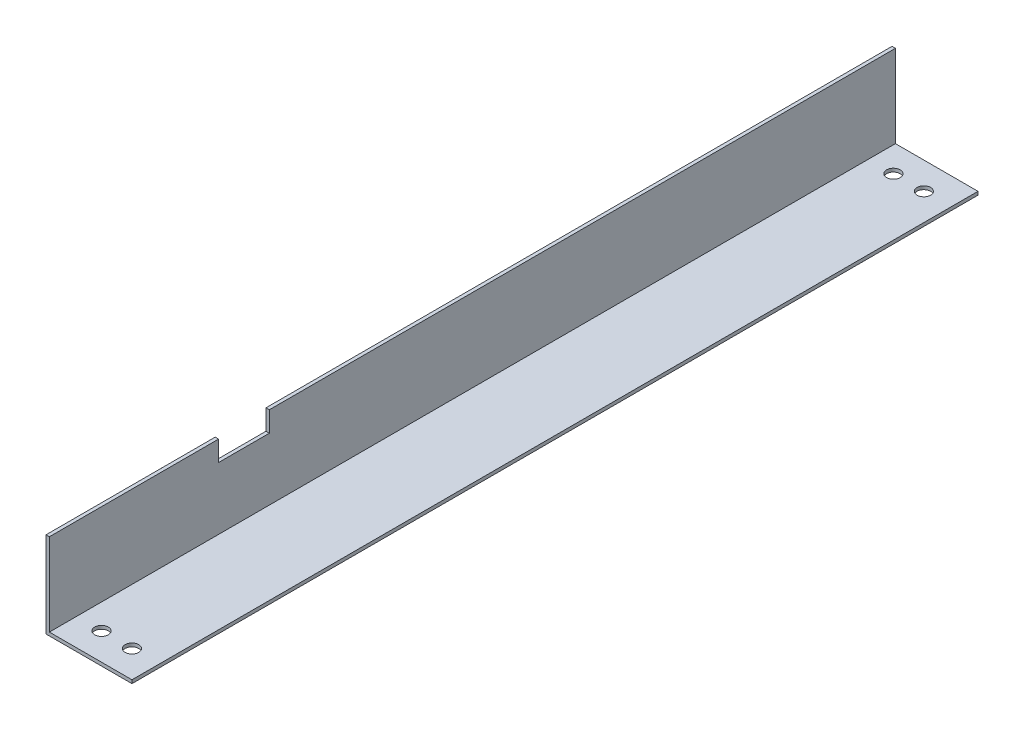
ISO-10303-21;
HEADER;
FILE_DESCRIPTION(('STEP AP214'),'2;1');
FILE_NAME('part.step','',(''),(''),'','','');
FILE_SCHEMA(('AUTOMOTIVE_DESIGN { 1 0 10303 214 1 1 1 1 }'));
ENDSEC;
DATA;
#1=APPLICATION_CONTEXT('core data for automotive mechanical design processes');
#2=APPLICATION_PROTOCOL_DEFINITION('international standard','automotive_design',2000,#1);
#3=PRODUCT_CONTEXT('',#1,'mechanical');
#4=PRODUCT('Part','Part','',(#3));
#5=PRODUCT_RELATED_PRODUCT_CATEGORY('part','',(#4));
#6=PRODUCT_DEFINITION_FORMATION('','',#4);
#7=PRODUCT_DEFINITION_CONTEXT('part definition',#1,'design');
#8=PRODUCT_DEFINITION('design','',#6,#7);
#9=PRODUCT_DEFINITION_SHAPE('','',#8);
#10=(LENGTH_UNIT() NAMED_UNIT(*) SI_UNIT(.MILLI.,.METRE.));
#11=(NAMED_UNIT(*) PLANE_ANGLE_UNIT() SI_UNIT($,.RADIAN.));
#12=(NAMED_UNIT(*) SI_UNIT($,.STERADIAN.) SOLID_ANGLE_UNIT());
#13=UNCERTAINTY_MEASURE_WITH_UNIT(LENGTH_MEASURE(1.E-05),#10,'distance_accuracy_value','');
#14=(GEOMETRIC_REPRESENTATION_CONTEXT(3) GLOBAL_UNCERTAINTY_ASSIGNED_CONTEXT((#13)) GLOBAL_UNIT_ASSIGNED_CONTEXT((#10,
#11,#12)) REPRESENTATION_CONTEXT('',''));
#15=CARTESIAN_POINT('',(0.,0.,0.));
#16=DIRECTION('',(0.,0.,1.));
#17=DIRECTION('',(1.,0.,0.));
#18=AXIS2_PLACEMENT_3D('',#15,#16,#17);
#19=CARTESIAN_POINT('',(1.,25.4,-250.));
#20=DIRECTION('',(0.,1.,0.));
#21=DIRECTION('',(0.,0.,1.));
#22=AXIS2_PLACEMENT_3D('',#19,#20,#21);
#23=PLANE('',#22);
#24=DIRECTION('',(1.,0.,0.));
#25=VECTOR('',#24,1.);
#26=CARTESIAN_POINT('',(-16.1554944214035,25.4,-65.));
#27=LINE('',#26,#25);
#28=CARTESIAN_POINT('',(0.,25.4,-65.));
#29=VERTEX_POINT('',#28);
#30=CARTESIAN_POINT('',(1.,25.4,-65.));
#31=VERTEX_POINT('',#30);
#32=EDGE_CURVE('E185',#29,#31,#27,.T.);
#33=ORIENTED_EDGE('',*,*,#32,.T.);
#34=DIRECTION('',(0.,0.,1.));
#35=VECTOR('',#34,1.);
#36=CARTESIAN_POINT('',(1.,25.4,-250.));
#37=LINE('',#36,#35);
#38=CARTESIAN_POINT('',(1.,25.4,-250.));
#39=VERTEX_POINT('',#38);
#40=EDGE_CURVE('E155',#39,#31,#37,.T.);
#41=ORIENTED_EDGE('',*,*,#40,.F.);
#42=DIRECTION('',(-1.,0.,0.));
#43=VECTOR('',#42,1.);
#44=CARTESIAN_POINT('',(1.,25.4,-250.));
#45=LINE('',#44,#43);
#46=CARTESIAN_POINT('',(0.,25.4,-250.));
#47=VERTEX_POINT('',#46);
#48=EDGE_CURVE('E128',#39,#47,#45,.T.);
#49=ORIENTED_EDGE('',*,*,#48,.T.);
#50=DIRECTION('',(0.,0.,1.));
#51=VECTOR('',#50,1.);
#52=CARTESIAN_POINT('',(0.,25.4,-250.));
#53=LINE('',#52,#51);
#54=EDGE_CURVE('E11',#47,#29,#53,.T.);
#55=ORIENTED_EDGE('',*,*,#54,.T.);
#56=EDGE_LOOP('',(#33,#41,#49,#55));
#57=FACE_BOUND('',#56,.T.);
#58=ADVANCED_FACE('F33',(#57),#23,.T.);
#59=CARTESIAN_POINT('',(0.,25.4,-250.));
#60=DIRECTION('',(-1.,0.,0.));
#61=DIRECTION('',(0.,0.,1.));
#62=AXIS2_PLACEMENT_3D('',#59,#60,#61);
#63=PLANE('',#62);
#64=DIRECTION('',(0.,1.,0.));
#65=VECTOR('',#64,1.);
#66=CARTESIAN_POINT('',(0.,25.4,-65.));
#67=LINE('',#66,#65);
#68=CARTESIAN_POINT('',(0.,19.4,-65.));
#69=VERTEX_POINT('',#68);
#70=EDGE_CURVE('E183',#69,#29,#67,.T.);
#71=ORIENTED_EDGE('',*,*,#70,.T.);
#72=ORIENTED_EDGE('',*,*,#54,.F.);
#73=DIRECTION('',(0.,-1.,0.));
#74=VECTOR('',#73,1.);
#75=CARTESIAN_POINT('',(0.,25.4,-250.));
#76=LINE('',#75,#74);
#77=CARTESIAN_POINT('',(0.,0.,-250.));
#78=VERTEX_POINT('',#77);
#79=EDGE_CURVE('E153',#47,#78,#76,.T.);
#80=ORIENTED_EDGE('',*,*,#79,.T.);
#81=DIRECTION('',(0.,0.,1.));
#82=VECTOR('',#81,1.);
#83=CARTESIAN_POINT('',(0.,0.,-250.));
#84=LINE('',#83,#82);
#85=CARTESIAN_POINT('',(0.,0.,0.));
#86=VERTEX_POINT('',#85);
#87=EDGE_CURVE('E37',#78,#86,#84,.T.);
#88=ORIENTED_EDGE('',*,*,#87,.T.);
#89=DIRECTION('',(0.,-1.,0.));
#90=VECTOR('',#89,1.);
#91=CARTESIAN_POINT('',(0.,25.4,0.));
#92=LINE('',#91,#90);
#93=CARTESIAN_POINT('',(0.,25.4,0.));
#94=VERTEX_POINT('',#93);
#95=EDGE_CURVE('E138',#94,#86,#92,.T.);
#96=ORIENTED_EDGE('',*,*,#95,.F.);
#97=CARTESIAN_POINT('',(0.,25.4,-50.));
#98=VERTEX_POINT('',#97);
#99=EDGE_CURVE('E42',#98,#94,#53,.T.);
#100=ORIENTED_EDGE('',*,*,#99,.F.);
#101=DIRECTION('',(0.,-1.,0.));
#102=VECTOR('',#101,1.);
#103=CARTESIAN_POINT('',(0.,25.4,-50.));
#104=LINE('',#103,#102);
#105=CARTESIAN_POINT('',(0.,19.4,-50.));
#106=VERTEX_POINT('',#105);
#107=EDGE_CURVE('E179',#98,#106,#104,.T.);
#108=ORIENTED_EDGE('',*,*,#107,.T.);
#109=DIRECTION('',(0.,0.,-1.));
#110=VECTOR('',#109,1.);
#111=CARTESIAN_POINT('',(0.,19.4,-50.));
#112=LINE('',#111,#110);
#113=EDGE_CURVE('E175',#106,#69,#112,.T.);
#114=ORIENTED_EDGE('',*,*,#113,.T.);
#115=EDGE_LOOP('',(#71,#72,#80,#88,#96,#100,#108,#114));
#116=FACE_BOUND('',#115,.T.);
#117=ADVANCED_FACE('F35',(#116),#63,.T.);
#118=DIRECTION('',(1.,0.,0.));
#119=VECTOR('',#118,1.);
#120=CARTESIAN_POINT('',(-16.1554944214035,25.4,-50.));
#121=LINE('',#120,#119);
#122=CARTESIAN_POINT('',(1.,25.4,-50.));
#123=VERTEX_POINT('',#122);
#124=EDGE_CURVE('E50',#98,#123,#121,.T.);
#125=ORIENTED_EDGE('',*,*,#124,.F.);
#126=ORIENTED_EDGE('',*,*,#99,.T.);
#127=DIRECTION('',(-1.,0.,0.));
#128=VECTOR('',#127,1.);
#129=CARTESIAN_POINT('',(1.,25.4,0.));
#130=LINE('',#129,#128);
#131=CARTESIAN_POINT('',(1.,25.4,0.));
#132=VERTEX_POINT('',#131);
#133=EDGE_CURVE('E151',#132,#94,#130,.T.);
#134=ORIENTED_EDGE('',*,*,#133,.F.);
#135=EDGE_CURVE('E118',#123,#132,#37,.T.);
#136=ORIENTED_EDGE('',*,*,#135,.F.);
#137=EDGE_LOOP('',(#125,#126,#134,#136));
#138=FACE_BOUND('',#137,.T.);
#139=ADVANCED_FACE('F163',(#138),#23,.T.);
#140=CARTESIAN_POINT('',(1.,0.999999999999997,-250.));
#141=DIRECTION('',(1.,0.,0.));
#142=DIRECTION('',(0.,1.,0.));
#143=AXIS2_PLACEMENT_3D('',#140,#141,#142);
#144=PLANE('',#143);
#145=DIRECTION('',(0.,1.,0.));
#146=VECTOR('',#145,1.);
#147=CARTESIAN_POINT('',(1.,25.4,-65.));
#148=LINE('',#147,#146);
#149=CARTESIAN_POINT('',(1.,19.4,-65.));
#150=VERTEX_POINT('',#149);
#151=EDGE_CURVE('E171',#150,#31,#148,.T.);
#152=ORIENTED_EDGE('',*,*,#151,.F.);
#153=DIRECTION('',(0.,0.,-1.));
#154=VECTOR('',#153,1.);
#155=CARTESIAN_POINT('',(1.,19.4,-50.));
#156=LINE('',#155,#154);
#157=CARTESIAN_POINT('',(1.,19.4,-50.));
#158=VERTEX_POINT('',#157);
#159=EDGE_CURVE('E168',#158,#150,#156,.T.);
#160=ORIENTED_EDGE('',*,*,#159,.F.);
#161=DIRECTION('',(0.,-1.,0.));
#162=VECTOR('',#161,1.);
#163=CARTESIAN_POINT('',(1.,25.4,-50.));
#164=LINE('',#163,#162);
#165=EDGE_CURVE('E166',#123,#158,#164,.T.);
#166=ORIENTED_EDGE('',*,*,#165,.F.);
#167=ORIENTED_EDGE('',*,*,#135,.T.);
#168=DIRECTION('',(0.,1.,0.));
#169=VECTOR('',#168,1.);
#170=CARTESIAN_POINT('',(1.,0.999999999999997,0.));
#171=LINE('',#170,#169);
#172=CARTESIAN_POINT('',(1.,0.999999999999997,0.));
#173=VERTEX_POINT('',#172);
#174=EDGE_CURVE('E113',#173,#132,#171,.T.);
#175=ORIENTED_EDGE('',*,*,#174,.F.);
#176=DIRECTION('',(0.,0.,1.));
#177=VECTOR('',#176,1.);
#178=CARTESIAN_POINT('',(1.,0.999999999999997,-250.));
#179=LINE('',#178,#177);
#180=CARTESIAN_POINT('',(1.,0.999999999999997,-250.));
#181=VERTEX_POINT('',#180);
#182=EDGE_CURVE('E105',#181,#173,#179,.T.);
#183=ORIENTED_EDGE('',*,*,#182,.F.);
#184=DIRECTION('',(0.,1.,0.));
#185=VECTOR('',#184,1.);
#186=CARTESIAN_POINT('',(1.,0.999999999999997,-250.));
#187=LINE('',#186,#185);
#188=EDGE_CURVE('E110',#181,#39,#187,.T.);
#189=ORIENTED_EDGE('',*,*,#188,.T.);
#190=ORIENTED_EDGE('',*,*,#40,.T.);
#191=EDGE_LOOP('',(#152,#160,#166,#167,#175,#183,#189,#190));
#192=FACE_BOUND('',#191,.T.);
#193=ADVANCED_FACE('F108',(#192),#144,.T.);
#194=CARTESIAN_POINT('',(25.4,1.,-250.));
#195=DIRECTION('',(0.,1.,0.));
#196=DIRECTION('',(-1.,0.,0.));
#197=AXIS2_PLACEMENT_3D('',#194,#195,#196);
#198=PLANE('',#197);
#199=CARTESIAN_POINT('',(17.4,0.999999999999999,-8.));
#200=DIRECTION('',(0.,1.,0.));
#201=DIRECTION('',(-1.,0.,0.));
#202=AXIS2_PLACEMENT_3D('',#199,#200,#201);
#203=CIRCLE('',#202,2.);
#204=CARTESIAN_POINT('',(15.4,0.999999999999999,-8.));
#205=VERTEX_POINT('',#204);
#206=EDGE_CURVE('E194',#205,#205,#203,.T.);
#207=ORIENTED_EDGE('',*,*,#206,.F.);
#208=EDGE_LOOP('',(#207));
#209=FACE_BOUND('',#208,.T.);
#210=CARTESIAN_POINT('',(8.4,0.999999999999998,-242.));
#211=DIRECTION('',(0.,1.,0.));
#212=DIRECTION('',(-1.,0.,0.));
#213=AXIS2_PLACEMENT_3D('',#210,#211,#212);
#214=CIRCLE('',#213,2.);
#215=CARTESIAN_POINT('',(6.4,0.999999999999998,-242.));
#216=VERTEX_POINT('',#215);
#217=EDGE_CURVE('E202',#216,#216,#214,.T.);
#218=ORIENTED_EDGE('',*,*,#217,.F.);
#219=EDGE_LOOP('',(#218));
#220=FACE_BOUND('',#219,.T.);
#221=CARTESIAN_POINT('',(17.4,0.999999999999999,-242.));
#222=DIRECTION('',(0.,1.,0.));
#223=DIRECTION('',(-1.,0.,0.));
#224=AXIS2_PLACEMENT_3D('',#221,#222,#223);
#225=CIRCLE('',#224,2.);
#226=CARTESIAN_POINT('',(15.4,0.999999999999999,-242.));
#227=VERTEX_POINT('',#226);
#228=EDGE_CURVE('E193',#227,#227,#225,.T.);
#229=ORIENTED_EDGE('',*,*,#228,.F.);
#230=EDGE_LOOP('',(#229));
#231=FACE_BOUND('',#230,.T.);
#232=CARTESIAN_POINT('',(8.4,0.999999999999998,-8.));
#233=DIRECTION('',(0.,1.,0.));
#234=DIRECTION('',(-1.,0.,0.));
#235=AXIS2_PLACEMENT_3D('',#232,#233,#234);
#236=CIRCLE('',#235,2.);
#237=CARTESIAN_POINT('',(6.4,0.999999999999998,-8.));
#238=VERTEX_POINT('',#237);
#239=EDGE_CURVE('E201',#238,#238,#236,.T.);
#240=ORIENTED_EDGE('',*,*,#239,.F.);
#241=EDGE_LOOP('',(#240));
#242=FACE_BOUND('',#241,.T.);
#243=DIRECTION('',(-1.,0.,0.));
#244=VECTOR('',#243,1.);
#245=CARTESIAN_POINT('',(25.4,1.,0.));
#246=LINE('',#245,#244);
#247=CARTESIAN_POINT('',(25.4,1.,0.));
#248=VERTEX_POINT('',#247);
#249=EDGE_CURVE('E148',#248,#173,#246,.T.);
#250=ORIENTED_EDGE('',*,*,#249,.F.);
#251=DIRECTION('',(0.,0.,1.));
#252=VECTOR('',#251,1.);
#253=CARTESIAN_POINT('',(25.4,1.,-250.));
#254=LINE('',#253,#252);
#255=CARTESIAN_POINT('',(25.4,1.,-250.));
#256=VERTEX_POINT('',#255);
#257=EDGE_CURVE('E119',#256,#248,#254,.T.);
#258=ORIENTED_EDGE('',*,*,#257,.F.);
#259=DIRECTION('',(-1.,0.,0.));
#260=VECTOR('',#259,1.);
#261=CARTESIAN_POINT('',(25.4,1.,-250.));
#262=LINE('',#261,#260);
#263=EDGE_CURVE('E125',#256,#181,#262,.T.);
#264=ORIENTED_EDGE('',*,*,#263,.T.);
#265=ORIENTED_EDGE('',*,*,#182,.T.);
#266=EDGE_LOOP('',(#250,#258,#264,#265));
#267=FACE_BOUND('',#266,.T.);
#268=ADVANCED_FACE('F130',(#209,#220,#231,#242,#267),#198,.T.);
#269=CARTESIAN_POINT('',(25.4,0.,-250.));
#270=DIRECTION('',(1.,0.,0.));
#271=DIRECTION('',(0.,0.,-1.));
#272=AXIS2_PLACEMENT_3D('',#269,#270,#271);
#273=PLANE('',#272);
#274=DIRECTION('',(0.,1.,0.));
#275=VECTOR('',#274,1.);
#276=CARTESIAN_POINT('',(25.4,0.,0.));
#277=LINE('',#276,#275);
#278=CARTESIAN_POINT('',(25.4,0.,0.));
#279=VERTEX_POINT('',#278);
#280=EDGE_CURVE('E145',#279,#248,#277,.T.);
#281=ORIENTED_EDGE('',*,*,#280,.F.);
#282=DIRECTION('',(0.,0.,1.));
#283=VECTOR('',#282,1.);
#284=CARTESIAN_POINT('',(25.4,0.,-250.));
#285=LINE('',#284,#283);
#286=CARTESIAN_POINT('',(25.4,0.,-250.));
#287=VERTEX_POINT('',#286);
#288=EDGE_CURVE('E157',#287,#279,#285,.T.);
#289=ORIENTED_EDGE('',*,*,#288,.F.);
#290=DIRECTION('',(0.,1.,0.));
#291=VECTOR('',#290,1.);
#292=CARTESIAN_POINT('',(25.4,0.,-250.));
#293=LINE('',#292,#291);
#294=EDGE_CURVE('E131',#287,#256,#293,.T.);
#295=ORIENTED_EDGE('',*,*,#294,.T.);
#296=ORIENTED_EDGE('',*,*,#257,.T.);
#297=EDGE_LOOP('',(#281,#289,#295,#296));
#298=FACE_BOUND('',#297,.T.);
#299=ADVANCED_FACE('F217',(#298),#273,.T.);
#300=CARTESIAN_POINT('',(0.,0.,-250.));
#301=DIRECTION('',(0.,-1.,0.));
#302=DIRECTION('',(0.,0.,-1.));
#303=AXIS2_PLACEMENT_3D('',#300,#301,#302);
#304=PLANE('',#303);
#305=CARTESIAN_POINT('',(17.4,0.,-8.));
#306=DIRECTION('',(0.,-1.,0.));
#307=DIRECTION('',(0.,0.,-1.));
#308=AXIS2_PLACEMENT_3D('',#305,#306,#307);
#309=CIRCLE('',#308,2.);
#310=CARTESIAN_POINT('',(17.4,0.,-10.));
#311=VERTEX_POINT('',#310);
#312=EDGE_CURVE('E197',#311,#311,#309,.F.);
#313=ORIENTED_EDGE('',*,*,#312,.T.);
#314=EDGE_LOOP('',(#313));
#315=FACE_BOUND('',#314,.T.);
#316=CARTESIAN_POINT('',(8.4,0.,-242.));
#317=DIRECTION('',(0.,-1.,0.));
#318=DIRECTION('',(0.,0.,-1.));
#319=AXIS2_PLACEMENT_3D('',#316,#317,#318);
#320=CIRCLE('',#319,2.);
#321=CARTESIAN_POINT('',(8.4,0.,-244.));
#322=VERTEX_POINT('',#321);
#323=EDGE_CURVE('E198',#322,#322,#320,.F.);
#324=ORIENTED_EDGE('',*,*,#323,.T.);
#325=EDGE_LOOP('',(#324));
#326=FACE_BOUND('',#325,.T.);
#327=CARTESIAN_POINT('',(17.4,0.,-242.));
#328=DIRECTION('',(0.,-1.,0.));
#329=DIRECTION('',(0.,0.,-1.));
#330=AXIS2_PLACEMENT_3D('',#327,#328,#329);
#331=CIRCLE('',#330,2.);
#332=CARTESIAN_POINT('',(17.4,0.,-244.));
#333=VERTEX_POINT('',#332);
#334=EDGE_CURVE('E205',#333,#333,#331,.F.);
#335=ORIENTED_EDGE('',*,*,#334,.T.);
#336=EDGE_LOOP('',(#335));
#337=FACE_BOUND('',#336,.T.);
#338=CARTESIAN_POINT('',(8.4,0.,-8.));
#339=DIRECTION('',(0.,-1.,0.));
#340=DIRECTION('',(0.,0.,-1.));
#341=AXIS2_PLACEMENT_3D('',#338,#339,#340);
#342=CIRCLE('',#341,2.);
#343=CARTESIAN_POINT('',(8.4,0.,-10.));
#344=VERTEX_POINT('',#343);
#345=EDGE_CURVE('E142',#344,#344,#342,.F.);
#346=ORIENTED_EDGE('',*,*,#345,.T.);
#347=EDGE_LOOP('',(#346));
#348=FACE_BOUND('',#347,.T.);
#349=DIRECTION('',(1.,0.,0.));
#350=VECTOR('',#349,1.);
#351=CARTESIAN_POINT('',(0.,0.,0.));
#352=LINE('',#351,#350);
#353=EDGE_CURVE('E141',#86,#279,#352,.T.);
#354=ORIENTED_EDGE('',*,*,#353,.F.);
#355=ORIENTED_EDGE('',*,*,#87,.F.);
#356=DIRECTION('',(1.,0.,0.));
#357=VECTOR('',#356,1.);
#358=CARTESIAN_POINT('',(0.,0.,-250.));
#359=LINE('',#358,#357);
#360=EDGE_CURVE('E133',#78,#287,#359,.T.);
#361=ORIENTED_EDGE('',*,*,#360,.T.);
#362=ORIENTED_EDGE('',*,*,#288,.T.);
#363=EDGE_LOOP('',(#354,#355,#361,#362));
#364=FACE_BOUND('',#363,.T.);
#365=ADVANCED_FACE('F159',(#315,#326,#337,#348,#364),#304,.T.);
#366=CARTESIAN_POINT('',(0.,0.,-250.));
#367=DIRECTION('',(0.,0.,1.));
#368=DIRECTION('',(1.,0.,0.));
#369=AXIS2_PLACEMENT_3D('',#366,#367,#368);
#370=PLANE('',#369);
#371=ORIENTED_EDGE('',*,*,#79,.F.);
#372=ORIENTED_EDGE('',*,*,#48,.F.);
#373=ORIENTED_EDGE('',*,*,#188,.F.);
#374=ORIENTED_EDGE('',*,*,#263,.F.);
#375=ORIENTED_EDGE('',*,*,#294,.F.);
#376=ORIENTED_EDGE('',*,*,#360,.F.);
#377=EDGE_LOOP('',(#371,#372,#373,#374,#375,#376));
#378=FACE_BOUND('',#377,.T.);
#379=ADVANCED_FACE('F123',(#378),#370,.F.);
#380=CARTESIAN_POINT('',(0.,0.,0.));
#381=DIRECTION('',(0.,0.,1.));
#382=DIRECTION('',(1.,0.,0.));
#383=AXIS2_PLACEMENT_3D('',#380,#381,#382);
#384=PLANE('',#383);
#385=ORIENTED_EDGE('',*,*,#95,.T.);
#386=ORIENTED_EDGE('',*,*,#353,.T.);
#387=ORIENTED_EDGE('',*,*,#280,.T.);
#388=ORIENTED_EDGE('',*,*,#249,.T.);
#389=ORIENTED_EDGE('',*,*,#174,.T.);
#390=ORIENTED_EDGE('',*,*,#133,.T.);
#391=EDGE_LOOP('',(#385,#386,#387,#388,#389,#390));
#392=FACE_BOUND('',#391,.T.);
#393=ADVANCED_FACE('F161',(#392),#384,.T.);
#394=CARTESIAN_POINT('',(8.4,-5.65685424949239,-8.));
#395=DIRECTION('',(0.,1.,0.));
#396=DIRECTION('',(-1.,0.,0.));
#397=AXIS2_PLACEMENT_3D('',#394,#395,#396);
#398=CYLINDRICAL_SURFACE('',#397,2.);
#399=ORIENTED_EDGE('',*,*,#239,.T.);
#400=EDGE_LOOP('',(#399));
#401=FACE_BOUND('',#400,.T.);
#402=ORIENTED_EDGE('',*,*,#345,.F.);
#403=EDGE_LOOP('',(#402));
#404=FACE_BOUND('',#403,.T.);
#405=ADVANCED_FACE('F286',(#401,#404),#398,.F.);
#406=CARTESIAN_POINT('',(17.4,-5.65685424949239,-242.));
#407=DIRECTION('',(0.,1.,0.));
#408=DIRECTION('',(-1.,0.,0.));
#409=AXIS2_PLACEMENT_3D('',#406,#407,#408);
#410=CYLINDRICAL_SURFACE('',#409,2.);
#411=ORIENTED_EDGE('',*,*,#228,.T.);
#412=EDGE_LOOP('',(#411));
#413=FACE_BOUND('',#412,.T.);
#414=ORIENTED_EDGE('',*,*,#334,.F.);
#415=EDGE_LOOP('',(#414));
#416=FACE_BOUND('',#415,.T.);
#417=ADVANCED_FACE('F282',(#413,#416),#410,.F.);
#418=CARTESIAN_POINT('',(8.4,-5.65685424949239,-242.));
#419=DIRECTION('',(0.,1.,0.));
#420=DIRECTION('',(-1.,0.,0.));
#421=AXIS2_PLACEMENT_3D('',#418,#419,#420);
#422=CYLINDRICAL_SURFACE('',#421,2.);
#423=ORIENTED_EDGE('',*,*,#217,.T.);
#424=EDGE_LOOP('',(#423));
#425=FACE_BOUND('',#424,.T.);
#426=ORIENTED_EDGE('',*,*,#323,.F.);
#427=EDGE_LOOP('',(#426));
#428=FACE_BOUND('',#427,.T.);
#429=ADVANCED_FACE('F278',(#425,#428),#422,.F.);
#430=CARTESIAN_POINT('',(17.4,-5.65685424949239,-8.));
#431=DIRECTION('',(0.,1.,0.));
#432=DIRECTION('',(-1.,0.,0.));
#433=AXIS2_PLACEMENT_3D('',#430,#431,#432);
#434=CYLINDRICAL_SURFACE('',#433,2.);
#435=ORIENTED_EDGE('',*,*,#206,.T.);
#436=EDGE_LOOP('',(#435));
#437=FACE_BOUND('',#436,.T.);
#438=ORIENTED_EDGE('',*,*,#312,.F.);
#439=EDGE_LOOP('',(#438));
#440=FACE_BOUND('',#439,.T.);
#441=ADVANCED_FACE('F251',(#437,#440),#434,.F.);
#442=CARTESIAN_POINT('',(-16.1554944214035,19.4,-50.));
#443=DIRECTION('',(0.,-1.,0.));
#444=DIRECTION('',(1.,0.,0.));
#445=AXIS2_PLACEMENT_3D('',#442,#443,#444);
#446=PLANE('',#445);
#447=DIRECTION('',(1.,0.,0.));
#448=VECTOR('',#447,1.);
#449=CARTESIAN_POINT('',(-16.1554944214035,19.4,-50.));
#450=LINE('',#449,#448);
#451=EDGE_CURVE('E182',#106,#158,#450,.T.);
#452=ORIENTED_EDGE('',*,*,#451,.T.);
#453=ORIENTED_EDGE('',*,*,#159,.T.);
#454=DIRECTION('',(1.,0.,0.));
#455=VECTOR('',#454,1.);
#456=CARTESIAN_POINT('',(-16.1554944214035,19.4,-65.));
#457=LINE('',#456,#455);
#458=EDGE_CURVE('E178',#69,#150,#457,.T.);
#459=ORIENTED_EDGE('',*,*,#458,.F.);
#460=ORIENTED_EDGE('',*,*,#113,.F.);
#461=EDGE_LOOP('',(#452,#453,#459,#460));
#462=FACE_BOUND('',#461,.T.);
#463=ADVANCED_FACE('F245',(#462),#446,.F.);
#464=CARTESIAN_POINT('',(-16.1554944214035,25.4,-65.));
#465=DIRECTION('',(0.,0.,-1.));
#466=DIRECTION('',(-1.,0.,0.));
#467=AXIS2_PLACEMENT_3D('',#464,#465,#466);
#468=PLANE('',#467);
#469=ORIENTED_EDGE('',*,*,#458,.T.);
#470=ORIENTED_EDGE('',*,*,#151,.T.);
#471=ORIENTED_EDGE('',*,*,#32,.F.);
#472=ORIENTED_EDGE('',*,*,#70,.F.);
#473=EDGE_LOOP('',(#469,#470,#471,#472));
#474=FACE_BOUND('',#473,.T.);
#475=ADVANCED_FACE('F250',(#474),#468,.F.);
#476=CARTESIAN_POINT('',(-16.1554944214035,25.4,-50.));
#477=DIRECTION('',(0.,0.,1.));
#478=DIRECTION('',(0.,-1.,0.));
#479=AXIS2_PLACEMENT_3D('',#476,#477,#478);
#480=PLANE('',#479);
#481=ORIENTED_EDGE('',*,*,#124,.T.);
#482=ORIENTED_EDGE('',*,*,#165,.T.);
#483=ORIENTED_EDGE('',*,*,#451,.F.);
#484=ORIENTED_EDGE('',*,*,#107,.F.);
#485=EDGE_LOOP('',(#481,#482,#483,#484));
#486=FACE_BOUND('',#485,.T.);
#487=ADVANCED_FACE('F262',(#486),#480,.F.);
#488=CLOSED_SHELL('',(#58,#117,#139,#193,#268,#299,#365,#379,#393,#405,#417,#429,#441,#463,#475,#487));
#489=MANIFOLD_SOLID_BREP('B2',#488);
#490=ADVANCED_BREP_SHAPE_REPRESENTATION('',(#18,#489),#14);
#491=SHAPE_DEFINITION_REPRESENTATION(#9,#490);
ENDSEC;
END-ISO-10303-21;
